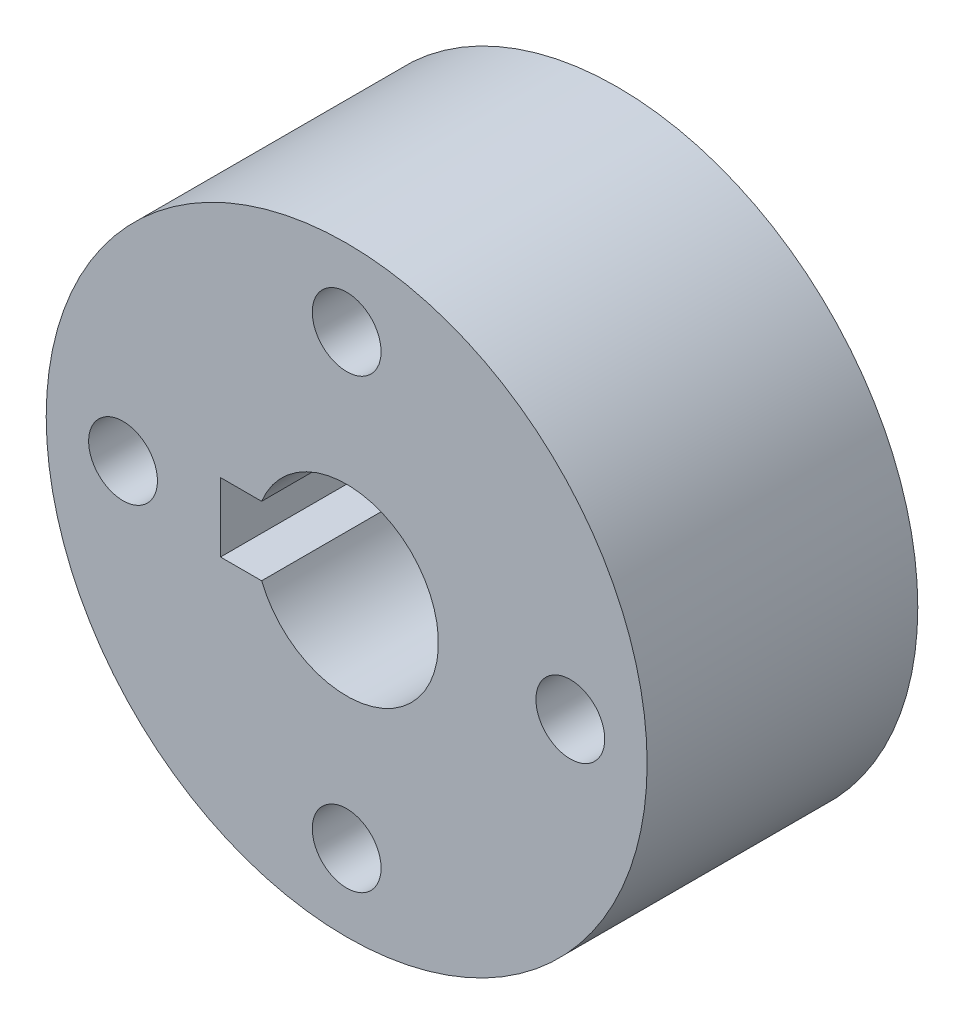
ISO-10303-21;
HEADER;
FILE_DESCRIPTION(('STEP AP214'),'2;1');
FILE_NAME('part.step','',(''),(''),'','','');
FILE_SCHEMA(('AUTOMOTIVE_DESIGN { 1 0 10303 214 1 1 1 1 }'));
ENDSEC;
DATA;
#1=APPLICATION_CONTEXT('core data for automotive mechanical design processes');
#2=APPLICATION_PROTOCOL_DEFINITION('international standard','automotive_design',2000,#1);
#3=PRODUCT_CONTEXT('',#1,'mechanical');
#4=PRODUCT('Part','Part','',(#3));
#5=PRODUCT_RELATED_PRODUCT_CATEGORY('part','',(#4));
#6=PRODUCT_DEFINITION_FORMATION('','',#4);
#7=PRODUCT_DEFINITION_CONTEXT('part definition',#1,'design');
#8=PRODUCT_DEFINITION('design','',#6,#7);
#9=PRODUCT_DEFINITION_SHAPE('','',#8);
#10=(LENGTH_UNIT() NAMED_UNIT(*) SI_UNIT(.MILLI.,.METRE.));
#11=(NAMED_UNIT(*) PLANE_ANGLE_UNIT() SI_UNIT($,.RADIAN.));
#12=(NAMED_UNIT(*) SI_UNIT($,.STERADIAN.) SOLID_ANGLE_UNIT());
#13=UNCERTAINTY_MEASURE_WITH_UNIT(LENGTH_MEASURE(1.E-05),#10,'distance_accuracy_value','');
#14=(GEOMETRIC_REPRESENTATION_CONTEXT(3) GLOBAL_UNCERTAINTY_ASSIGNED_CONTEXT((#13)) GLOBAL_UNIT_ASSIGNED_CONTEXT((#10,
#11,#12)) REPRESENTATION_CONTEXT('',''));
#15=CARTESIAN_POINT('',(0.,0.,0.));
#16=DIRECTION('',(0.,0.,1.));
#17=DIRECTION('',(1.,0.,0.));
#18=AXIS2_PLACEMENT_3D('',#15,#16,#17);
#19=CARTESIAN_POINT('',(0.,0.,11.8));
#20=DIRECTION('',(0.,0.,-1.));
#21=DIRECTION('',(-1.,0.,0.));
#22=AXIS2_PLACEMENT_3D('',#19,#20,#21);
#23=CYLINDRICAL_SURFACE('',#22,13.1);
#24=CARTESIAN_POINT('',(0.,0.,11.8));
#25=DIRECTION('',(0.,0.,1.));
#26=DIRECTION('',(1.,0.,0.));
#27=AXIS2_PLACEMENT_3D('',#24,#25,#26);
#28=CIRCLE('',#27,13.1);
#29=CARTESIAN_POINT('',(13.1,0.,11.8));
#30=VERTEX_POINT('',#29);
#31=EDGE_CURVE('E132',#30,#30,#28,.T.);
#32=ORIENTED_EDGE('',*,*,#31,.F.);
#33=EDGE_LOOP('',(#32));
#34=FACE_BOUND('',#33,.T.);
#35=CARTESIAN_POINT('',(0.,0.,0.));
#36=DIRECTION('',(0.,0.,1.));
#37=DIRECTION('',(1.,0.,0.));
#38=AXIS2_PLACEMENT_3D('',#35,#36,#37);
#39=CIRCLE('',#38,13.1);
#40=CARTESIAN_POINT('',(13.1,0.,0.));
#41=VERTEX_POINT('',#40);
#42=EDGE_CURVE('E117',#41,#41,#39,.T.);
#43=ORIENTED_EDGE('',*,*,#42,.T.);
#44=EDGE_LOOP('',(#43));
#45=FACE_BOUND('',#44,.T.);
#46=ADVANCED_FACE('F39',(#34,#45),#23,.T.);
#47=CARTESIAN_POINT('',(0.,0.,11.8));
#48=DIRECTION('',(0.,0.,1.));
#49=DIRECTION('',(1.,0.,0.));
#50=AXIS2_PLACEMENT_3D('',#47,#48,#49);
#51=PLANE('',#50);
#52=DIRECTION('',(-1.,0.,0.));
#53=VECTOR('',#52,1.);
#54=CARTESIAN_POINT('',(-5.5,1.5,11.8));
#55=LINE('',#54,#53);
#56=CARTESIAN_POINT('',(-3.70809924354783,1.5,11.8));
#57=VERTEX_POINT('',#56);
#58=CARTESIAN_POINT('',(-5.5,1.5,11.8));
#59=VERTEX_POINT('',#58);
#60=EDGE_CURVE('E53',#57,#59,#55,.T.);
#61=ORIENTED_EDGE('',*,*,#60,.F.);
#62=CARTESIAN_POINT('',(0.,0.,11.8));
#63=DIRECTION('',(0.,0.,1.));
#64=DIRECTION('',(1.,0.,0.));
#65=AXIS2_PLACEMENT_3D('',#62,#63,#64);
#66=CIRCLE('',#65,4.);
#67=CARTESIAN_POINT('',(-3.70809924354783,-1.5,11.8));
#68=VERTEX_POINT('',#67);
#69=EDGE_CURVE('E98',#68,#57,#66,.T.);
#70=ORIENTED_EDGE('',*,*,#69,.F.);
#71=DIRECTION('',(1.,0.,0.));
#72=VECTOR('',#71,1.);
#73=CARTESIAN_POINT('',(-5.5,-1.5,11.8));
#74=LINE('',#73,#72);
#75=CARTESIAN_POINT('',(-5.5,-1.5,11.8));
#76=VERTEX_POINT('',#75);
#77=EDGE_CURVE('E82',#76,#68,#74,.T.);
#78=ORIENTED_EDGE('',*,*,#77,.F.);
#79=DIRECTION('',(0.,-1.,0.));
#80=VECTOR('',#79,1.);
#81=CARTESIAN_POINT('',(-5.5,-1.5,11.8));
#82=LINE('',#81,#80);
#83=EDGE_CURVE('E91',#59,#76,#82,.T.);
#84=ORIENTED_EDGE('',*,*,#83,.F.);
#85=EDGE_LOOP('',(#61,#70,#78,#84));
#86=FACE_BOUND('',#85,.T.);
#87=CARTESIAN_POINT('',(-9.75,0.,11.8));
#88=DIRECTION('',(0.,0.,1.));
#89=DIRECTION('',(1.,0.,0.));
#90=AXIS2_PLACEMENT_3D('',#87,#88,#89);
#91=CIRCLE('',#90,1.5);
#92=CARTESIAN_POINT('',(-8.25,0.,11.8));
#93=VERTEX_POINT('',#92);
#94=EDGE_CURVE('E114',#93,#93,#91,.T.);
#95=ORIENTED_EDGE('',*,*,#94,.F.);
#96=EDGE_LOOP('',(#95));
#97=FACE_BOUND('',#96,.T.);
#98=CARTESIAN_POINT('',(0.,9.75,11.8));
#99=DIRECTION('',(0.,0.,1.));
#100=DIRECTION('',(1.,0.,0.));
#101=AXIS2_PLACEMENT_3D('',#98,#99,#100);
#102=CIRCLE('',#101,1.5);
#103=CARTESIAN_POINT('',(1.50000000000003,9.75,11.8));
#104=VERTEX_POINT('',#103);
#105=EDGE_CURVE('E118',#104,#104,#102,.T.);
#106=ORIENTED_EDGE('',*,*,#105,.F.);
#107=EDGE_LOOP('',(#106));
#108=FACE_BOUND('',#107,.T.);
#109=CARTESIAN_POINT('',(9.75,0.,11.8));
#110=DIRECTION('',(0.,0.,1.));
#111=DIRECTION('',(1.,0.,0.));
#112=AXIS2_PLACEMENT_3D('',#109,#110,#111);
#113=CIRCLE('',#112,1.5);
#114=CARTESIAN_POINT('',(11.25,0.,11.8));
#115=VERTEX_POINT('',#114);
#116=EDGE_CURVE('E124',#115,#115,#113,.T.);
#117=ORIENTED_EDGE('',*,*,#116,.F.);
#118=EDGE_LOOP('',(#117));
#119=FACE_BOUND('',#118,.T.);
#120=CARTESIAN_POINT('',(-1.02125829161162E-13,-9.75,11.8));
#121=DIRECTION('',(0.,0.,1.));
#122=DIRECTION('',(1.,0.,0.));
#123=AXIS2_PLACEMENT_3D('',#120,#121,#122);
#124=CIRCLE('',#123,1.5);
#125=CARTESIAN_POINT('',(1.4999999999999,-9.75,11.8));
#126=VERTEX_POINT('',#125);
#127=EDGE_CURVE('E127',#126,#126,#124,.T.);
#128=ORIENTED_EDGE('',*,*,#127,.F.);
#129=EDGE_LOOP('',(#128));
#130=FACE_BOUND('',#129,.T.);
#131=ORIENTED_EDGE('',*,*,#31,.T.);
#132=EDGE_LOOP('',(#131));
#133=FACE_BOUND('',#132,.T.);
#134=ADVANCED_FACE('F95',(#86,#97,#108,#119,#130,#133),#51,.T.);
#135=CARTESIAN_POINT('',(0.,0.,0.));
#136=DIRECTION('',(0.,0.,1.));
#137=DIRECTION('',(1.,0.,0.));
#138=AXIS2_PLACEMENT_3D('',#135,#136,#137);
#139=PLANE('',#138);
#140=CARTESIAN_POINT('',(-9.75,0.,0.));
#141=DIRECTION('',(0.,0.,1.));
#142=DIRECTION('',(1.,0.,0.));
#143=AXIS2_PLACEMENT_3D('',#140,#141,#142);
#144=CIRCLE('',#143,1.5);
#145=CARTESIAN_POINT('',(-8.25,0.,0.));
#146=VERTEX_POINT('',#145);
#147=EDGE_CURVE('E105',#146,#146,#144,.T.);
#148=ORIENTED_EDGE('',*,*,#147,.T.);
#149=EDGE_LOOP('',(#148));
#150=FACE_BOUND('',#149,.T.);
#151=CARTESIAN_POINT('',(9.75,0.,0.));
#152=DIRECTION('',(0.,0.,1.));
#153=DIRECTION('',(1.,0.,0.));
#154=AXIS2_PLACEMENT_3D('',#151,#152,#153);
#155=CIRCLE('',#154,1.5);
#156=CARTESIAN_POINT('',(11.25,0.,0.));
#157=VERTEX_POINT('',#156);
#158=EDGE_CURVE('E110',#157,#157,#155,.T.);
#159=ORIENTED_EDGE('',*,*,#158,.T.);
#160=EDGE_LOOP('',(#159));
#161=FACE_BOUND('',#160,.T.);
#162=CARTESIAN_POINT('',(0.,0.,0.));
#163=DIRECTION('',(0.,0.,1.));
#164=DIRECTION('',(1.,0.,0.));
#165=AXIS2_PLACEMENT_3D('',#162,#163,#164);
#166=CIRCLE('',#165,4.);
#167=CARTESIAN_POINT('',(-3.70809924354783,-1.5,0.));
#168=VERTEX_POINT('',#167);
#169=CARTESIAN_POINT('',(-3.70809924354783,1.5,0.));
#170=VERTEX_POINT('',#169);
#171=EDGE_CURVE('E46',#168,#170,#166,.T.);
#172=ORIENTED_EDGE('',*,*,#171,.T.);
#173=DIRECTION('',(-1.,0.,0.));
#174=VECTOR('',#173,1.);
#175=CARTESIAN_POINT('',(0.,1.5,0.));
#176=LINE('',#175,#174);
#177=CARTESIAN_POINT('',(-5.5,1.5,0.));
#178=VERTEX_POINT('',#177);
#179=EDGE_CURVE('E11',#170,#178,#176,.T.);
#180=ORIENTED_EDGE('',*,*,#179,.T.);
#181=DIRECTION('',(0.,-1.,0.));
#182=VECTOR('',#181,1.);
#183=CARTESIAN_POINT('',(-5.5,0.,0.));
#184=LINE('',#183,#182);
#185=CARTESIAN_POINT('',(-5.5,-1.5,0.));
#186=VERTEX_POINT('',#185);
#187=EDGE_CURVE('E135',#178,#186,#184,.T.);
#188=ORIENTED_EDGE('',*,*,#187,.T.);
#189=DIRECTION('',(1.,0.,0.));
#190=VECTOR('',#189,1.);
#191=CARTESIAN_POINT('',(0.,-1.5,0.));
#192=LINE('',#191,#190);
#193=EDGE_CURVE('E85',#186,#168,#192,.T.);
#194=ORIENTED_EDGE('',*,*,#193,.T.);
#195=EDGE_LOOP('',(#172,#180,#188,#194));
#196=FACE_BOUND('',#195,.T.);
#197=ORIENTED_EDGE('',*,*,#42,.F.);
#198=EDGE_LOOP('',(#197));
#199=FACE_BOUND('',#198,.T.);
#200=ADVANCED_FACE('F141',(#150,#161,#196,#199),#139,.F.);
#201=CARTESIAN_POINT('',(-1.02125829161162E-13,-9.75,6.8));
#202=DIRECTION('',(0.,0.,1.));
#203=DIRECTION('',(1.,0.,0.));
#204=AXIS2_PLACEMENT_3D('',#201,#202,#203);
#205=CYLINDRICAL_SURFACE('',#204,1.5);
#206=CARTESIAN_POINT('',(-1.02125829161162E-13,-9.75,6.8));
#207=DIRECTION('',(0.,0.,1.));
#208=DIRECTION('',(1.,0.,0.));
#209=AXIS2_PLACEMENT_3D('',#206,#207,#208);
#210=CIRCLE('',#209,1.5);
#211=CARTESIAN_POINT('',(1.4999999999999,-9.75,6.8));
#212=VERTEX_POINT('',#211);
#213=EDGE_CURVE('E113',#212,#212,#210,.T.);
#214=ORIENTED_EDGE('',*,*,#213,.F.);
#215=EDGE_LOOP('',(#214));
#216=FACE_BOUND('',#215,.T.);
#217=ORIENTED_EDGE('',*,*,#127,.T.);
#218=EDGE_LOOP('',(#217));
#219=FACE_BOUND('',#218,.T.);
#220=ADVANCED_FACE('F170',(#216,#219),#205,.F.);
#221=CARTESIAN_POINT('',(-1.02125829161162E-13,-9.75,6.8));
#222=DIRECTION('',(0.,0.,1.));
#223=DIRECTION('',(1.,0.,0.));
#224=AXIS2_PLACEMENT_3D('',#221,#222,#223);
#225=PLANE('',#224);
#226=ORIENTED_EDGE('',*,*,#213,.T.);
#227=EDGE_LOOP('',(#226));
#228=FACE_BOUND('',#227,.T.);
#229=ADVANCED_FACE('F176',(#228),#225,.T.);
#230=CARTESIAN_POINT('',(9.75,0.,6.8));
#231=DIRECTION('',(0.,0.,1.));
#232=DIRECTION('',(1.,0.,0.));
#233=AXIS2_PLACEMENT_3D('',#230,#231,#232);
#234=CYLINDRICAL_SURFACE('',#233,1.5);
#235=ORIENTED_EDGE('',*,*,#116,.T.);
#236=EDGE_LOOP('',(#235));
#237=FACE_BOUND('',#236,.T.);
#238=ORIENTED_EDGE('',*,*,#158,.F.);
#239=EDGE_LOOP('',(#238));
#240=FACE_BOUND('',#239,.T.);
#241=ADVANCED_FACE('F182',(#237,#240),#234,.F.);
#242=CARTESIAN_POINT('',(0.,9.75,6.8));
#243=DIRECTION('',(0.,0.,1.));
#244=DIRECTION('',(1.,0.,0.));
#245=AXIS2_PLACEMENT_3D('',#242,#243,#244);
#246=CYLINDRICAL_SURFACE('',#245,1.5);
#247=CARTESIAN_POINT('',(0.,9.75,6.8));
#248=DIRECTION('',(0.,0.,1.));
#249=DIRECTION('',(1.,0.,0.));
#250=AXIS2_PLACEMENT_3D('',#247,#248,#249);
#251=CIRCLE('',#250,1.5);
#252=CARTESIAN_POINT('',(1.50000000000003,9.75,6.8));
#253=VERTEX_POINT('',#252);
#254=EDGE_CURVE('E121',#253,#253,#251,.T.);
#255=ORIENTED_EDGE('',*,*,#254,.F.);
#256=EDGE_LOOP('',(#255));
#257=FACE_BOUND('',#256,.T.);
#258=ORIENTED_EDGE('',*,*,#105,.T.);
#259=EDGE_LOOP('',(#258));
#260=FACE_BOUND('',#259,.T.);
#261=ADVANCED_FACE('F187',(#257,#260),#246,.F.);
#262=CARTESIAN_POINT('',(0.,9.75,6.8));
#263=DIRECTION('',(0.,0.,1.));
#264=DIRECTION('',(1.,0.,0.));
#265=AXIS2_PLACEMENT_3D('',#262,#263,#264);
#266=PLANE('',#265);
#267=ORIENTED_EDGE('',*,*,#254,.T.);
#268=EDGE_LOOP('',(#267));
#269=FACE_BOUND('',#268,.T.);
#270=ADVANCED_FACE('F155',(#269),#266,.T.);
#271=CARTESIAN_POINT('',(-9.75,0.,6.8));
#272=DIRECTION('',(0.,0.,1.));
#273=DIRECTION('',(1.,0.,0.));
#274=AXIS2_PLACEMENT_3D('',#271,#272,#273);
#275=CYLINDRICAL_SURFACE('',#274,1.5);
#276=ORIENTED_EDGE('',*,*,#94,.T.);
#277=EDGE_LOOP('',(#276));
#278=FACE_BOUND('',#277,.T.);
#279=ORIENTED_EDGE('',*,*,#147,.F.);
#280=EDGE_LOOP('',(#279));
#281=FACE_BOUND('',#280,.T.);
#282=ADVANCED_FACE('F148',(#278,#281),#275,.F.);
#283=CARTESIAN_POINT('',(-5.5,1.5,-3.2));
#284=DIRECTION('',(0.,1.,0.));
#285=DIRECTION('',(0.,0.,1.));
#286=AXIS2_PLACEMENT_3D('',#283,#284,#285);
#287=PLANE('',#286);
#288=DIRECTION('',(0.,0.,1.));
#289=VECTOR('',#288,1.);
#290=CARTESIAN_POINT('',(-3.70809924354783,1.5,-3.2));
#291=LINE('',#290,#289);
#292=EDGE_CURVE('E103',#170,#57,#291,.T.);
#293=ORIENTED_EDGE('',*,*,#292,.T.);
#294=ORIENTED_EDGE('',*,*,#60,.T.);
#295=DIRECTION('',(0.,0.,1.));
#296=VECTOR('',#295,1.);
#297=CARTESIAN_POINT('',(-5.5,1.5,-3.2));
#298=LINE('',#297,#296);
#299=EDGE_CURVE('E88',#178,#59,#298,.T.);
#300=ORIENTED_EDGE('',*,*,#299,.F.);
#301=ORIENTED_EDGE('',*,*,#179,.F.);
#302=EDGE_LOOP('',(#293,#294,#300,#301));
#303=FACE_BOUND('',#302,.T.);
#304=ADVANCED_FACE('F146',(#303),#287,.F.);
#305=CARTESIAN_POINT('',(0.,0.,-3.2));
#306=DIRECTION('',(0.,0.,1.));
#307=DIRECTION('',(1.,0.,0.));
#308=AXIS2_PLACEMENT_3D('',#305,#306,#307);
#309=CYLINDRICAL_SURFACE('',#308,4.);
#310=DIRECTION('',(0.,0.,1.));
#311=VECTOR('',#310,1.);
#312=CARTESIAN_POINT('',(-3.70809924354783,-1.5,-3.2));
#313=LINE('',#312,#311);
#314=EDGE_CURVE('E87',#168,#68,#313,.T.);
#315=ORIENTED_EDGE('',*,*,#314,.T.);
#316=ORIENTED_EDGE('',*,*,#69,.T.);
#317=ORIENTED_EDGE('',*,*,#292,.F.);
#318=ORIENTED_EDGE('',*,*,#171,.F.);
#319=EDGE_LOOP('',(#315,#316,#317,#318));
#320=FACE_BOUND('',#319,.T.);
#321=ADVANCED_FACE('F145',(#320),#309,.F.);
#322=CARTESIAN_POINT('',(-5.5,-1.5,-3.2));
#323=DIRECTION('',(0.,-1.,0.));
#324=DIRECTION('',(0.,0.,-1.));
#325=AXIS2_PLACEMENT_3D('',#322,#323,#324);
#326=PLANE('',#325);
#327=DIRECTION('',(0.,0.,1.));
#328=VECTOR('',#327,1.);
#329=CARTESIAN_POINT('',(-5.5,-1.5,-3.2));
#330=LINE('',#329,#328);
#331=EDGE_CURVE('E61',#186,#76,#330,.T.);
#332=ORIENTED_EDGE('',*,*,#331,.T.);
#333=ORIENTED_EDGE('',*,*,#77,.T.);
#334=ORIENTED_EDGE('',*,*,#314,.F.);
#335=ORIENTED_EDGE('',*,*,#193,.F.);
#336=EDGE_LOOP('',(#332,#333,#334,#335));
#337=FACE_BOUND('',#336,.T.);
#338=ADVANCED_FACE('F79',(#337),#326,.F.);
#339=CARTESIAN_POINT('',(-5.5,-1.5,-3.2));
#340=DIRECTION('',(-1.,0.,0.));
#341=DIRECTION('',(0.,0.,1.));
#342=AXIS2_PLACEMENT_3D('',#339,#340,#341);
#343=PLANE('',#342);
#344=ORIENTED_EDGE('',*,*,#299,.T.);
#345=ORIENTED_EDGE('',*,*,#83,.T.);
#346=ORIENTED_EDGE('',*,*,#331,.F.);
#347=ORIENTED_EDGE('',*,*,#187,.F.);
#348=EDGE_LOOP('',(#344,#345,#346,#347));
#349=FACE_BOUND('',#348,.T.);
#350=ADVANCED_FACE('F92',(#349),#343,.F.);
#351=CLOSED_SHELL('',(#46,#134,#200,#220,#229,#241,#261,#270,#282,#304,#321,#338,#350));
#352=MANIFOLD_SOLID_BREP('B2',#351);
#353=ADVANCED_BREP_SHAPE_REPRESENTATION('',(#18,#352),#14);
#354=SHAPE_DEFINITION_REPRESENTATION(#9,#353);
ENDSEC;
END-ISO-10303-21;
